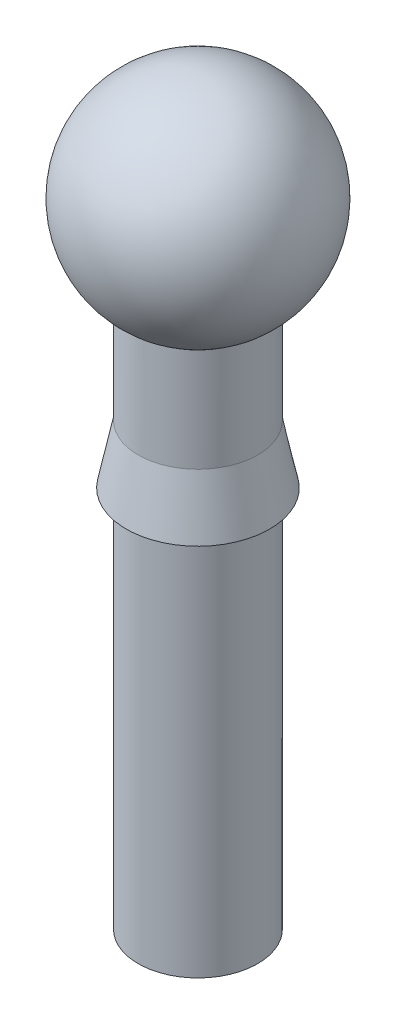
ISO-10303-21;
HEADER;
FILE_DESCRIPTION(('STEP AP214'),'2;1');
FILE_NAME('part.step','',(''),(''),'','','');
FILE_SCHEMA(('AUTOMOTIVE_DESIGN { 1 0 10303 214 1 1 1 1 }'));
ENDSEC;
DATA;
#1=APPLICATION_CONTEXT('core data for automotive mechanical design processes');
#2=APPLICATION_PROTOCOL_DEFINITION('international standard','automotive_design',2000,#1);
#3=PRODUCT_CONTEXT('',#1,'mechanical');
#4=PRODUCT('Part','Part','',(#3));
#5=PRODUCT_RELATED_PRODUCT_CATEGORY('part','',(#4));
#6=PRODUCT_DEFINITION_FORMATION('','',#4);
#7=PRODUCT_DEFINITION_CONTEXT('part definition',#1,'design');
#8=PRODUCT_DEFINITION('design','',#6,#7);
#9=PRODUCT_DEFINITION_SHAPE('','',#8);
#10=(LENGTH_UNIT() NAMED_UNIT(*) SI_UNIT(.MILLI.,.METRE.));
#11=(NAMED_UNIT(*) PLANE_ANGLE_UNIT() SI_UNIT($,.RADIAN.));
#12=(NAMED_UNIT(*) SI_UNIT($,.STERADIAN.) SOLID_ANGLE_UNIT());
#13=UNCERTAINTY_MEASURE_WITH_UNIT(LENGTH_MEASURE(1.E-05),#10,'distance_accuracy_value','');
#14=(GEOMETRIC_REPRESENTATION_CONTEXT(3) GLOBAL_UNCERTAINTY_ASSIGNED_CONTEXT((#13)) GLOBAL_UNIT_ASSIGNED_CONTEXT((#10,
#11,#12)) REPRESENTATION_CONTEXT('',''));
#15=CARTESIAN_POINT('',(0.,0.,0.));
#16=DIRECTION('',(0.,0.,1.));
#17=DIRECTION('',(1.,0.,0.));
#18=AXIS2_PLACEMENT_3D('',#15,#16,#17);
#19=CARTESIAN_POINT('',(0.,26.5,0.));
#20=DIRECTION('',(0.,-1.,0.));
#21=DIRECTION('',(1.,0.,0.));
#22=AXIS2_PLACEMENT_3D('',#19,#20,#21);
#23=SPHERICAL_SURFACE('',#22,4.5);
#24=CARTESIAN_POINT('',(0.,22.7583426132261,0.));
#25=DIRECTION('',(0.,-1.,0.));
#26=DIRECTION('',(0.,0.,-1.));
#27=AXIS2_PLACEMENT_3D('',#24,#25,#26);
#28=CIRCLE('',#27,2.5);
#29=CARTESIAN_POINT('',(0.,22.7583426132261,-2.5));
#30=VERTEX_POINT('',#29);
#31=EDGE_CURVE('E58',#30,#30,#28,.T.);
#32=ORIENTED_EDGE('',*,*,#31,.F.);
#33=EDGE_LOOP('',(#32));
#34=FACE_BOUND('',#33,.T.);
#35=ADVANCED_FACE('F39',(#34),#23,.T.);
#36=CARTESIAN_POINT('',(2.5,0.,0.));
#37=DIRECTION('',(0.,-1.,0.));
#38=DIRECTION('',(0.,0.,-1.));
#39=AXIS2_PLACEMENT_3D('',#36,#37,#38);
#40=PLANE('',#39);
#41=CARTESIAN_POINT('',(0.,0.,0.));
#42=DIRECTION('',(0.,-1.,0.));
#43=DIRECTION('',(0.,0.,-1.));
#44=AXIS2_PLACEMENT_3D('',#41,#42,#43);
#45=CIRCLE('',#44,2.5);
#46=CARTESIAN_POINT('',(0.,0.,-2.5));
#47=VERTEX_POINT('',#46);
#48=EDGE_CURVE('E10',#47,#47,#45,.T.);
#49=ORIENTED_EDGE('',*,*,#48,.T.);
#50=EDGE_LOOP('',(#49));
#51=FACE_BOUND('',#50,.T.);
#52=ADVANCED_FACE('F66',(#51),#40,.T.);
#53=CARTESIAN_POINT('',(0.,0.,0.));
#54=DIRECTION('',(0.,-1.,0.));
#55=DIRECTION('',(0.,0.,-1.));
#56=AXIS2_PLACEMENT_3D('',#53,#54,#55);
#57=CYLINDRICAL_SURFACE('',#56,2.5);
#58=CARTESIAN_POINT('',(0.,16.,0.));
#59=DIRECTION('',(0.,-1.,0.));
#60=DIRECTION('',(0.,0.,-1.));
#61=AXIS2_PLACEMENT_3D('',#58,#59,#60);
#62=CIRCLE('',#61,2.5);
#63=CARTESIAN_POINT('',(0.,16.,-2.5));
#64=VERTEX_POINT('',#63);
#65=EDGE_CURVE('E45',#64,#64,#62,.T.);
#66=ORIENTED_EDGE('',*,*,#65,.T.);
#67=EDGE_LOOP('',(#66));
#68=FACE_BOUND('',#67,.T.);
#69=ORIENTED_EDGE('',*,*,#48,.F.);
#70=EDGE_LOOP('',(#69));
#71=FACE_BOUND('',#70,.T.);
#72=ADVANCED_FACE('F70',(#68,#71),#57,.T.);
#73=CARTESIAN_POINT('',(3.,16.,0.));
#74=DIRECTION('',(0.,-1.,0.));
#75=DIRECTION('',(0.,0.,-1.));
#76=AXIS2_PLACEMENT_3D('',#73,#74,#75);
#77=PLANE('',#76);
#78=CARTESIAN_POINT('',(0.,16.,0.));
#79=DIRECTION('',(0.,-1.,0.));
#80=DIRECTION('',(0.,0.,-1.));
#81=AXIS2_PLACEMENT_3D('',#78,#79,#80);
#82=CIRCLE('',#81,3.);
#83=CARTESIAN_POINT('',(0.,16.,-3.));
#84=VERTEX_POINT('',#83);
#85=EDGE_CURVE('E49',#84,#84,#82,.T.);
#86=ORIENTED_EDGE('',*,*,#85,.T.);
#87=EDGE_LOOP('',(#86));
#88=FACE_BOUND('',#87,.T.);
#89=ORIENTED_EDGE('',*,*,#65,.F.);
#90=EDGE_LOOP('',(#89));
#91=FACE_BOUND('',#90,.T.);
#92=ADVANCED_FACE('F74',(#88,#91),#77,.T.);
#93=CARTESIAN_POINT('',(0.,16.,0.));
#94=DIRECTION('',(0.,-1.,0.));
#95=DIRECTION('',(0.,0.,-1.));
#96=AXIS2_PLACEMENT_3D('',#93,#94,#95);
#97=CONICAL_SURFACE('',#96,3.,0.202540800420703);
#98=CARTESIAN_POINT('',(0.,18.4347889303299,0.));
#99=DIRECTION('',(0.,-1.,0.));
#100=DIRECTION('',(0.,0.,-1.));
#101=AXIS2_PLACEMENT_3D('',#98,#99,#100);
#102=CIRCLE('',#101,2.5);
#103=CARTESIAN_POINT('',(0.,18.4347889303299,-2.5));
#104=VERTEX_POINT('',#103);
#105=EDGE_CURVE('E53',#104,#104,#102,.T.);
#106=ORIENTED_EDGE('',*,*,#105,.T.);
#107=EDGE_LOOP('',(#106));
#108=FACE_BOUND('',#107,.T.);
#109=ORIENTED_EDGE('',*,*,#85,.F.);
#110=EDGE_LOOP('',(#109));
#111=FACE_BOUND('',#110,.T.);
#112=ADVANCED_FACE('F79',(#108,#111),#97,.T.);
#113=CARTESIAN_POINT('',(0.,0.,0.));
#114=DIRECTION('',(0.,-1.,0.));
#115=DIRECTION('',(0.,0.,-1.));
#116=AXIS2_PLACEMENT_3D('',#113,#114,#115);
#117=CYLINDRICAL_SURFACE('',#116,2.5);
#118=ORIENTED_EDGE('',*,*,#31,.T.);
#119=EDGE_LOOP('',(#118));
#120=FACE_BOUND('',#119,.T.);
#121=ORIENTED_EDGE('',*,*,#105,.F.);
#122=EDGE_LOOP('',(#121));
#123=FACE_BOUND('',#122,.T.);
#124=ADVANCED_FACE('F62',(#120,#123),#117,.T.);
#125=CLOSED_SHELL('',(#35,#52,#72,#92,#112,#124));
#126=MANIFOLD_SOLID_BREP('B2',#125);
#127=ADVANCED_BREP_SHAPE_REPRESENTATION('',(#18,#126),#14);
#128=SHAPE_DEFINITION_REPRESENTATION(#9,#127);
ENDSEC;
END-ISO-10303-21;
